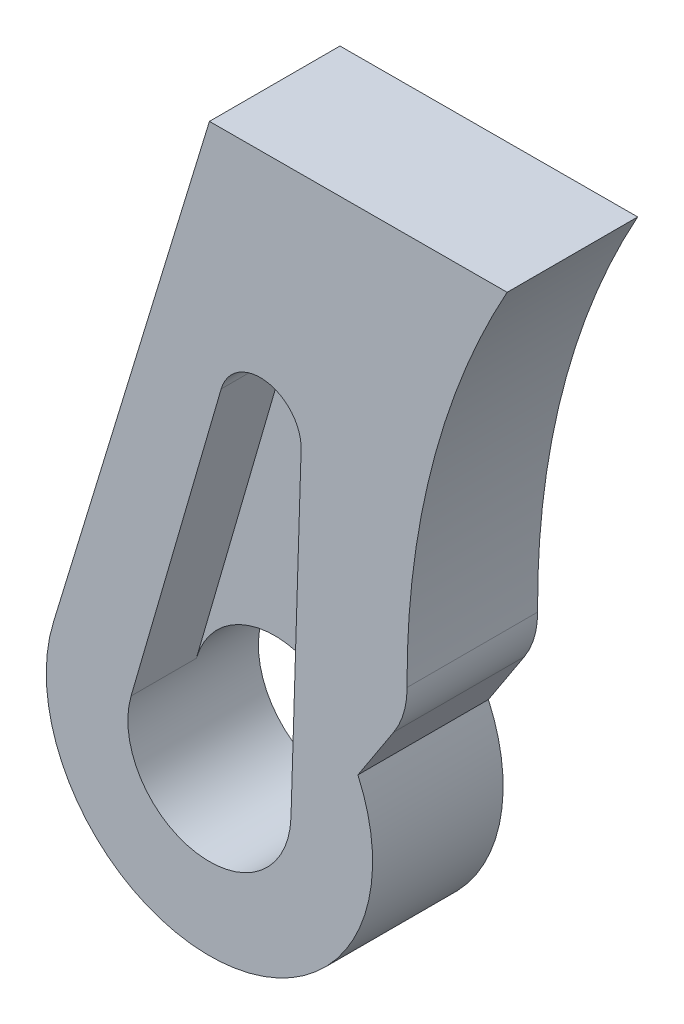
ISO-10303-21;
HEADER;
FILE_DESCRIPTION(('STEP AP214'),'2;1');
FILE_NAME('part.step','',(''),(''),'','','');
FILE_SCHEMA(('AUTOMOTIVE_DESIGN { 1 0 10303 214 1 1 1 1 }'));
ENDSEC;
DATA;
#1=APPLICATION_CONTEXT('core data for automotive mechanical design processes');
#2=APPLICATION_PROTOCOL_DEFINITION('international standard','automotive_design',2000,#1);
#3=PRODUCT_CONTEXT('',#1,'mechanical');
#4=PRODUCT('Part','Part','',(#3));
#5=PRODUCT_RELATED_PRODUCT_CATEGORY('part','',(#4));
#6=PRODUCT_DEFINITION_FORMATION('','',#4);
#7=PRODUCT_DEFINITION_CONTEXT('part definition',#1,'design');
#8=PRODUCT_DEFINITION('design','',#6,#7);
#9=PRODUCT_DEFINITION_SHAPE('','',#8);
#10=(LENGTH_UNIT() NAMED_UNIT(*) SI_UNIT(.MILLI.,.METRE.));
#11=(NAMED_UNIT(*) PLANE_ANGLE_UNIT() SI_UNIT($,.RADIAN.));
#12=(NAMED_UNIT(*) SI_UNIT($,.STERADIAN.) SOLID_ANGLE_UNIT());
#13=UNCERTAINTY_MEASURE_WITH_UNIT(LENGTH_MEASURE(1.E-05),#10,'distance_accuracy_value','');
#14=(GEOMETRIC_REPRESENTATION_CONTEXT(3) GLOBAL_UNCERTAINTY_ASSIGNED_CONTEXT((#13)) GLOBAL_UNIT_ASSIGNED_CONTEXT((#10,
#11,#12)) REPRESENTATION_CONTEXT('',''));
#15=CARTESIAN_POINT('',(0.,0.,0.));
#16=DIRECTION('',(0.,0.,1.));
#17=DIRECTION('',(1.,0.,0.));
#18=AXIS2_PLACEMENT_3D('',#15,#16,#17);
#19=CARTESIAN_POINT('',(0.,0.,8.));
#20=DIRECTION('',(0.,0.,-1.));
#21=DIRECTION('',(-1.,0.,0.));
#22=AXIS2_PLACEMENT_3D('',#19,#20,#21);
#23=CYLINDRICAL_SURFACE('',#22,5.);
#24=CARTESIAN_POINT('',(0.,0.,0.));
#25=DIRECTION('',(0.,0.,1.));
#26=DIRECTION('',(1.,0.,0.));
#27=AXIS2_PLACEMENT_3D('',#24,#25,#26);
#28=CIRCLE('',#27,5.);
#29=CARTESIAN_POINT('',(5.,0.,0.));
#30=VERTEX_POINT('',#29);
#31=EDGE_CURVE('E157',#30,#30,#28,.T.);
#32=ORIENTED_EDGE('',*,*,#31,.F.);
#33=EDGE_LOOP('',(#32));
#34=FACE_BOUND('',#33,.T.);
#35=CARTESIAN_POINT('',(0.,0.,8.));
#36=DIRECTION('',(0.,0.,1.));
#37=DIRECTION('',(1.,0.,0.));
#38=AXIS2_PLACEMENT_3D('',#35,#36,#37);
#39=CIRCLE('',#38,5.);
#40=CARTESIAN_POINT('',(-4.80254656117195,1.39123920580737,8.));
#41=VERTEX_POINT('',#40);
#42=CARTESIAN_POINT('',(4.99754882045745,-0.156543243688131,8.));
#43=VERTEX_POINT('',#42);
#44=EDGE_CURVE('E168',#41,#43,#39,.T.);
#45=ORIENTED_EDGE('',*,*,#44,.T.);
#46=DIRECTION('',(0.,0.,1.));
#47=VECTOR('',#46,1.);
#48=CARTESIAN_POINT('',(4.99754882045745,-0.156543243688131,4.));
#49=LINE('',#48,#47);
#50=CARTESIAN_POINT('',(4.99754882045745,-0.156543243688131,4.));
#51=VERTEX_POINT('',#50);
#52=EDGE_CURVE('E150',#51,#43,#49,.T.);
#53=ORIENTED_EDGE('',*,*,#52,.F.);
#54=CARTESIAN_POINT('',(0.,0.,4.));
#55=DIRECTION('',(0.,0.,1.));
#56=DIRECTION('',(1.,0.,0.));
#57=AXIS2_PLACEMENT_3D('',#54,#55,#56);
#58=CIRCLE('',#57,5.);
#59=CARTESIAN_POINT('',(-4.80254656117195,1.39123920580737,4.));
#60=VERTEX_POINT('',#59);
#61=EDGE_CURVE('E124',#51,#60,#58,.T.);
#62=ORIENTED_EDGE('',*,*,#61,.T.);
#63=DIRECTION('',(0.,0.,1.));
#64=VECTOR('',#63,1.);
#65=CARTESIAN_POINT('',(-4.80254656117195,1.39123920580737,4.));
#66=LINE('',#65,#64);
#67=EDGE_CURVE('E120',#60,#41,#66,.T.);
#68=ORIENTED_EDGE('',*,*,#67,.T.);
#69=EDGE_LOOP('',(#45,#53,#62,#68));
#70=FACE_BOUND('',#69,.T.);
#71=ADVANCED_FACE('F39',(#34,#70),#23,.F.);
#72=CARTESIAN_POINT('',(-9.56539161618039,2.91603896220644,8.));
#73=DIRECTION('',(0.956539161618038,-0.291603896220644,0.));
#74=DIRECTION('',(0.291603896220644,0.956539161618038,0.));
#75=AXIS2_PLACEMENT_3D('',#72,#73,#74);
#76=PLANE('',#75);
#77=DIRECTION('',(-0.291603896220644,-0.956539161618038,0.));
#78=VECTOR('',#77,1.);
#79=CARTESIAN_POINT('',(-9.56539161618039,2.91603896220644,0.));
#80=LINE('',#79,#78);
#81=CARTESIAN_POINT('',(0.,34.2930946040358,0.));
#82=VERTEX_POINT('',#81);
#83=CARTESIAN_POINT('',(-9.56539161618038,2.91603896220644,0.));
#84=VERTEX_POINT('',#83);
#85=EDGE_CURVE('E149',#82,#84,#80,.T.);
#86=ORIENTED_EDGE('',*,*,#85,.T.);
#87=DIRECTION('',(0.,0.,-1.));
#88=VECTOR('',#87,1.);
#89=CARTESIAN_POINT('',(-9.56539161618038,2.91603896220644,8.));
#90=LINE('',#89,#88);
#91=CARTESIAN_POINT('',(-9.56539161618038,2.91603896220644,8.));
#92=VERTEX_POINT('',#91);
#93=EDGE_CURVE('E192',#92,#84,#90,.T.);
#94=ORIENTED_EDGE('',*,*,#93,.F.);
#95=DIRECTION('',(-0.291603896220644,-0.956539161618038,0.));
#96=VECTOR('',#95,1.);
#97=CARTESIAN_POINT('',(-9.56539161618039,2.91603896220644,8.));
#98=LINE('',#97,#96);
#99=CARTESIAN_POINT('',(0.,34.2930946040358,8.));
#100=VERTEX_POINT('',#99);
#101=EDGE_CURVE('E153',#100,#92,#98,.T.);
#102=ORIENTED_EDGE('',*,*,#101,.F.);
#103=DIRECTION('',(0.,0.,-1.));
#104=VECTOR('',#103,1.);
#105=CARTESIAN_POINT('',(0.,34.2930946040358,8.));
#106=LINE('',#105,#104);
#107=EDGE_CURVE('E171',#100,#82,#106,.T.);
#108=ORIENTED_EDGE('',*,*,#107,.T.);
#109=EDGE_LOOP('',(#86,#94,#102,#108));
#110=FACE_BOUND('',#109,.T.);
#111=ADVANCED_FACE('F221',(#110),#76,.F.);
#112=CARTESIAN_POINT('',(0.,0.,8.));
#113=DIRECTION('',(0.,0.,-1.));
#114=DIRECTION('',(-1.,0.,0.));
#115=AXIS2_PLACEMENT_3D('',#112,#113,#114);
#116=CYLINDRICAL_SURFACE('',#115,10.);
#117=CARTESIAN_POINT('',(0.,0.,0.));
#118=DIRECTION('',(0.,0.,1.));
#119=DIRECTION('',(1.,0.,0.));
#120=AXIS2_PLACEMENT_3D('',#117,#118,#119);
#121=CIRCLE('',#120,10.);
#122=CARTESIAN_POINT('',(9.09715337627094,4.15232470413891,0.));
#123=VERTEX_POINT('',#122);
#124=EDGE_CURVE('E174',#84,#123,#121,.T.);
#125=ORIENTED_EDGE('',*,*,#124,.T.);
#126=DIRECTION('',(0.,0.,-1.));
#127=VECTOR('',#126,1.);
#128=CARTESIAN_POINT('',(9.09715337627094,4.15232470413891,8.));
#129=LINE('',#128,#127);
#130=CARTESIAN_POINT('',(9.09715337627094,4.15232470413891,8.));
#131=VERTEX_POINT('',#130);
#132=EDGE_CURVE('E189',#131,#123,#129,.T.);
#133=ORIENTED_EDGE('',*,*,#132,.F.);
#134=CARTESIAN_POINT('',(0.,0.,8.));
#135=DIRECTION('',(0.,0.,1.));
#136=DIRECTION('',(1.,0.,0.));
#137=AXIS2_PLACEMENT_3D('',#134,#135,#136);
#138=CIRCLE('',#137,10.);
#139=EDGE_CURVE('E156',#92,#131,#138,.T.);
#140=ORIENTED_EDGE('',*,*,#139,.F.);
#141=ORIENTED_EDGE('',*,*,#93,.T.);
#142=EDGE_LOOP('',(#125,#133,#140,#141));
#143=FACE_BOUND('',#142,.T.);
#144=ADVANCED_FACE('F227',(#143),#116,.T.);
#145=CARTESIAN_POINT('',(4.47876916712969,-2.92335031518233,8.));
#146=DIRECTION('',(0.837404025733565,-0.546584392098072,0.));
#147=DIRECTION('',(0.546584392098072,0.837404025733565,0.));
#148=AXIS2_PLACEMENT_3D('',#145,#146,#147);
#149=PLANE('',#148);
#150=DIRECTION('',(-0.546584392098072,-0.837404025733565,0.));
#151=VECTOR('',#150,1.);
#152=CARTESIAN_POINT('',(4.47876916712969,-2.92335031518233,0.));
#153=LINE('',#152,#151);
#154=CARTESIAN_POINT('',(11.2997418993409,7.52683836189885,0.));
#155=VERTEX_POINT('',#154);
#156=EDGE_CURVE('E177',#155,#123,#153,.T.);
#157=ORIENTED_EDGE('',*,*,#156,.F.);
#158=DIRECTION('',(0.,0.,-1.));
#159=VECTOR('',#158,1.);
#160=CARTESIAN_POINT('',(11.2997418993409,7.52683836189885,8.));
#161=LINE('',#160,#159);
#162=CARTESIAN_POINT('',(11.2997418993409,7.52683836189885,8.));
#163=VERTEX_POINT('',#162);
#164=EDGE_CURVE('E47',#155,#163,#161,.F.);
#165=ORIENTED_EDGE('',*,*,#164,.T.);
#166=DIRECTION('',(-0.546584392098072,-0.837404025733565,0.));
#167=VECTOR('',#166,1.);
#168=CARTESIAN_POINT('',(4.47876916712969,-2.92335031518233,8.));
#169=LINE('',#168,#167);
#170=EDGE_CURVE('E160',#163,#131,#169,.T.);
#171=ORIENTED_EDGE('',*,*,#170,.T.);
#172=ORIENTED_EDGE('',*,*,#132,.T.);
#173=EDGE_LOOP('',(#157,#165,#171,#172));
#174=FACE_BOUND('',#173,.T.);
#175=ADVANCED_FACE('F238',(#174),#149,.T.);
#176=CARTESIAN_POINT('',(60.710872791842,10.7049648955615,8.));
#177=DIRECTION('',(0.,0.,-1.));
#178=DIRECTION('',(-1.,0.,0.));
#179=AXIS2_PLACEMENT_3D('',#176,#177,#178);
#180=CYLINDRICAL_SURFACE('',#179,48.6);
#181=CARTESIAN_POINT('',(60.710872791842,10.7049648955615,8.));
#182=DIRECTION('',(0.,0.,1.));
#183=DIRECTION('',(1.,0.,0.));
#184=AXIS2_PLACEMENT_3D('',#181,#182,#183);
#185=CIRCLE('',#184,48.6);
#186=CARTESIAN_POINT('',(18.2476092566351,34.3445767777301,8.));
#187=VERTEX_POINT('',#186);
#188=CARTESIAN_POINT('',(12.1125492913045,10.3012905997374,8.));
#189=VERTEX_POINT('',#188);
#190=EDGE_CURVE('E162',#187,#189,#185,.T.);
#191=ORIENTED_EDGE('',*,*,#190,.T.);
#192=DIRECTION('',(0.,0.,-1.));
#193=VECTOR('',#192,1.);
#194=CARTESIAN_POINT('',(12.1125492913045,10.3012905997374,8.));
#195=LINE('',#194,#193);
#196=CARTESIAN_POINT('',(12.1125492913045,10.3012905997374,0.));
#197=VERTEX_POINT('',#196);
#198=EDGE_CURVE('E195',#189,#197,#195,.T.);
#199=ORIENTED_EDGE('',*,*,#198,.T.);
#200=CARTESIAN_POINT('',(60.710872791842,10.7049648955615,0.));
#201=DIRECTION('',(0.,0.,1.));
#202=DIRECTION('',(1.,0.,0.));
#203=AXIS2_PLACEMENT_3D('',#200,#201,#202);
#204=CIRCLE('',#203,48.6);
#205=CARTESIAN_POINT('',(18.2476092566351,34.3445767777301,0.));
#206=VERTEX_POINT('',#205);
#207=EDGE_CURVE('E179',#206,#197,#204,.T.);
#208=ORIENTED_EDGE('',*,*,#207,.F.);
#209=DIRECTION('',(0.,0.,-1.));
#210=VECTOR('',#209,1.);
#211=CARTESIAN_POINT('',(18.2476092566351,34.3445767777301,8.));
#212=LINE('',#211,#210);
#213=EDGE_CURVE('E187',#187,#206,#212,.T.);
#214=ORIENTED_EDGE('',*,*,#213,.F.);
#215=EDGE_LOOP('',(#191,#199,#208,#214));
#216=FACE_BOUND('',#215,.T.);
#217=ADVANCED_FACE('F201',(#216),#180,.F.);
#218=CARTESIAN_POINT('',(-0.0967507017122434,34.2928216402541,8.));
#219=DIRECTION('',(-0.0028212993865505,0.999996020126966,0.));
#220=DIRECTION('',(-0.999996020126966,-0.0028212993865505,0.));
#221=AXIS2_PLACEMENT_3D('',#218,#219,#220);
#222=PLANE('',#221);
#223=DIRECTION('',(0.999996020126966,0.0028212993865505,0.));
#224=VECTOR('',#223,1.);
#225=CARTESIAN_POINT('',(-0.0967507017122434,34.2928216402541,0.));
#226=LINE('',#225,#224);
#227=EDGE_CURVE('E181',#82,#206,#226,.T.);
#228=ORIENTED_EDGE('',*,*,#227,.F.);
#229=ORIENTED_EDGE('',*,*,#107,.F.);
#230=DIRECTION('',(0.999996020126966,0.0028212993865505,0.));
#231=VECTOR('',#230,1.);
#232=CARTESIAN_POINT('',(-0.0967507017122434,34.2928216402541,8.));
#233=LINE('',#232,#231);
#234=EDGE_CURVE('E165',#100,#187,#233,.T.);
#235=ORIENTED_EDGE('',*,*,#234,.T.);
#236=ORIENTED_EDGE('',*,*,#213,.T.);
#237=EDGE_LOOP('',(#228,#229,#235,#236));
#238=FACE_BOUND('',#237,.T.);
#239=ADVANCED_FACE('F210',(#238),#222,.T.);
#240=CARTESIAN_POINT('',(0.,0.,8.));
#241=DIRECTION('',(0.,0.,1.));
#242=DIRECTION('',(1.,0.,0.));
#243=AXIS2_PLACEMENT_3D('',#240,#241,#242);
#244=PLANE('',#243);
#245=DIRECTION('',(0.0313086487376258,0.999509764091489,0.));
#246=VECTOR('',#245,1.);
#247=CARTESIAN_POINT('',(4.99754882045745,-0.156543243688129,8.));
#248=LINE('',#247,#246);
#249=CARTESIAN_POINT('',(5.6188105587967,19.6768637720637,8.));
#250=VERTEX_POINT('',#249);
#251=EDGE_CURVE('E137',#43,#250,#248,.T.);
#252=ORIENTED_EDGE('',*,*,#251,.F.);
#253=ORIENTED_EDGE('',*,*,#44,.F.);
#254=DIRECTION('',(0.278247841161473,0.960509312234389,0.));
#255=VECTOR('',#254,1.);
#256=CARTESIAN_POINT('',(-4.80254656117195,1.39123920580737,8.));
#257=LINE('',#256,#255);
#258=CARTESIAN_POINT('',(0.718762867982005,20.4507549968115,8.));
#259=VERTEX_POINT('',#258);
#260=EDGE_CURVE('E140',#41,#259,#257,.T.);
#261=ORIENTED_EDGE('',*,*,#260,.T.);
#262=CARTESIAN_POINT('',(3.12003614856798,19.7551353939078,8.));
#263=DIRECTION('',(0.,0.,1.));
#264=DIRECTION('',(1.,0.,0.));
#265=AXIS2_PLACEMENT_3D('',#262,#263,#264);
#266=CIRCLE('',#265,2.49999999999998);
#267=EDGE_CURVE('E132',#250,#259,#266,.T.);
#268=ORIENTED_EDGE('',*,*,#267,.F.);
#269=EDGE_LOOP('',(#252,#253,#261,#268));
#270=FACE_BOUND('',#269,.T.);
#271=ORIENTED_EDGE('',*,*,#170,.F.);
#272=CARTESIAN_POINT('',(7.11272177067311,10.2597603223892,8.));
#273=DIRECTION('',(0.,0.,1.));
#274=DIRECTION('',(1.,0.,0.));
#275=AXIS2_PLACEMENT_3D('',#272,#273,#274);
#276=CIRCLE('',#275,5.);
#277=EDGE_CURVE('E11',#163,#189,#276,.T.);
#278=ORIENTED_EDGE('',*,*,#277,.T.);
#279=ORIENTED_EDGE('',*,*,#190,.F.);
#280=ORIENTED_EDGE('',*,*,#234,.F.);
#281=ORIENTED_EDGE('',*,*,#101,.T.);
#282=ORIENTED_EDGE('',*,*,#139,.T.);
#283=EDGE_LOOP('',(#271,#278,#279,#280,#281,#282));
#284=FACE_BOUND('',#283,.T.);
#285=ADVANCED_FACE('F214',(#270,#284),#244,.T.);
#286=CARTESIAN_POINT('',(0.,0.,0.));
#287=DIRECTION('',(0.,0.,1.));
#288=DIRECTION('',(1.,0.,0.));
#289=AXIS2_PLACEMENT_3D('',#286,#287,#288);
#290=PLANE('',#289);
#291=ORIENTED_EDGE('',*,*,#207,.T.);
#292=CARTESIAN_POINT('',(7.11272177067311,10.2597603223892,0.));
#293=DIRECTION('',(0.,0.,1.));
#294=DIRECTION('',(1.,0.,0.));
#295=AXIS2_PLACEMENT_3D('',#292,#293,#294);
#296=CIRCLE('',#295,5.);
#297=EDGE_CURVE('E61',#197,#155,#296,.F.);
#298=ORIENTED_EDGE('',*,*,#297,.T.);
#299=ORIENTED_EDGE('',*,*,#156,.T.);
#300=ORIENTED_EDGE('',*,*,#124,.F.);
#301=ORIENTED_EDGE('',*,*,#85,.F.);
#302=ORIENTED_EDGE('',*,*,#227,.T.);
#303=EDGE_LOOP('',(#291,#298,#299,#300,#301,#302));
#304=FACE_BOUND('',#303,.T.);
#305=ORIENTED_EDGE('',*,*,#31,.T.);
#306=EDGE_LOOP('',(#305));
#307=FACE_BOUND('',#306,.T.);
#308=ADVANCED_FACE('F205',(#304,#307),#290,.F.);
#309=CARTESIAN_POINT('',(3.12003614856798,19.7551353939078,4.));
#310=DIRECTION('',(0.,0.,1.));
#311=DIRECTION('',(1.,0.,0.));
#312=AXIS2_PLACEMENT_3D('',#309,#310,#311);
#313=CYLINDRICAL_SURFACE('',#312,2.49999999999998);
#314=ORIENTED_EDGE('',*,*,#267,.T.);
#315=DIRECTION('',(0.,0.,1.));
#316=VECTOR('',#315,1.);
#317=CARTESIAN_POINT('',(0.718762867982005,20.4507549968115,4.));
#318=LINE('',#317,#316);
#319=CARTESIAN_POINT('',(0.718762867982005,20.4507549968115,4.));
#320=VERTEX_POINT('',#319);
#321=EDGE_CURVE('E117',#320,#259,#318,.T.);
#322=ORIENTED_EDGE('',*,*,#321,.F.);
#323=CARTESIAN_POINT('',(3.12003614856798,19.7551353939078,4.));
#324=DIRECTION('',(0.,0.,1.));
#325=DIRECTION('',(1.,0.,0.));
#326=AXIS2_PLACEMENT_3D('',#323,#324,#325);
#327=CIRCLE('',#326,2.49999999999998);
#328=CARTESIAN_POINT('',(5.6188105587967,19.6768637720637,4.));
#329=VERTEX_POINT('',#328);
#330=EDGE_CURVE('E125',#329,#320,#327,.T.);
#331=ORIENTED_EDGE('',*,*,#330,.F.);
#332=DIRECTION('',(0.,0.,1.));
#333=VECTOR('',#332,1.);
#334=CARTESIAN_POINT('',(5.6188105587967,19.6768637720637,4.));
#335=LINE('',#334,#333);
#336=EDGE_CURVE('E147',#329,#250,#335,.T.);
#337=ORIENTED_EDGE('',*,*,#336,.T.);
#338=EDGE_LOOP('',(#314,#322,#331,#337));
#339=FACE_BOUND('',#338,.T.);
#340=ADVANCED_FACE('F129',(#339),#313,.F.);
#341=CARTESIAN_POINT('',(4.99754882045745,-0.156543243688129,4.));
#342=DIRECTION('',(0.999509764091489,-0.0313086487376258,0.));
#343=DIRECTION('',(0.0313086487376258,0.999509764091489,0.));
#344=AXIS2_PLACEMENT_3D('',#341,#342,#343);
#345=PLANE('',#344);
#346=ORIENTED_EDGE('',*,*,#251,.T.);
#347=ORIENTED_EDGE('',*,*,#336,.F.);
#348=DIRECTION('',(0.0313086487376258,0.999509764091489,0.));
#349=VECTOR('',#348,1.);
#350=CARTESIAN_POINT('',(4.99754882045745,-0.156543243688129,4.));
#351=LINE('',#350,#349);
#352=EDGE_CURVE('E133',#51,#329,#351,.T.);
#353=ORIENTED_EDGE('',*,*,#352,.F.);
#354=ORIENTED_EDGE('',*,*,#52,.T.);
#355=EDGE_LOOP('',(#346,#347,#353,#354));
#356=FACE_BOUND('',#355,.T.);
#357=ADVANCED_FACE('F279',(#356),#345,.F.);
#358=CARTESIAN_POINT('',(-4.80254656117195,1.39123920580737,4.));
#359=DIRECTION('',(0.960509312234389,-0.278247841161473,0.));
#360=DIRECTION('',(0.278247841161473,0.960509312234389,0.));
#361=AXIS2_PLACEMENT_3D('',#358,#359,#360);
#362=PLANE('',#361);
#363=ORIENTED_EDGE('',*,*,#260,.F.);
#364=ORIENTED_EDGE('',*,*,#67,.F.);
#365=DIRECTION('',(0.278247841161473,0.960509312234389,0.));
#366=VECTOR('',#365,1.);
#367=CARTESIAN_POINT('',(-4.80254656117195,1.39123920580737,4.));
#368=LINE('',#367,#366);
#369=EDGE_CURVE('E114',#60,#320,#368,.T.);
#370=ORIENTED_EDGE('',*,*,#369,.T.);
#371=ORIENTED_EDGE('',*,*,#321,.T.);
#372=EDGE_LOOP('',(#363,#364,#370,#371));
#373=FACE_BOUND('',#372,.T.);
#374=ADVANCED_FACE('F116',(#373),#362,.T.);
#375=CARTESIAN_POINT('',(3.12003614856798,19.7551353939078,4.));
#376=DIRECTION('',(0.,0.,1.));
#377=DIRECTION('',(1.,0.,0.));
#378=AXIS2_PLACEMENT_3D('',#375,#376,#377);
#379=PLANE('',#378);
#380=ORIENTED_EDGE('',*,*,#330,.T.);
#381=ORIENTED_EDGE('',*,*,#369,.F.);
#382=ORIENTED_EDGE('',*,*,#61,.F.);
#383=ORIENTED_EDGE('',*,*,#352,.T.);
#384=EDGE_LOOP('',(#380,#381,#382,#383));
#385=FACE_BOUND('',#384,.T.);
#386=ADVANCED_FACE('F135',(#385),#379,.T.);
#387=CARTESIAN_POINT('',(7.11272177067311,10.2597603223892,8.));
#388=DIRECTION('',(0.,0.,-1.));
#389=DIRECTION('',(-1.,0.,0.));
#390=AXIS2_PLACEMENT_3D('',#387,#388,#389);
#391=CYLINDRICAL_SURFACE('',#390,5.);
#392=ORIENTED_EDGE('',*,*,#277,.F.);
#393=ORIENTED_EDGE('',*,*,#164,.F.);
#394=ORIENTED_EDGE('',*,*,#297,.F.);
#395=ORIENTED_EDGE('',*,*,#198,.F.);
#396=EDGE_LOOP('',(#392,#393,#394,#395));
#397=FACE_BOUND('',#396,.T.);
#398=ADVANCED_FACE('F41',(#397),#391,.T.);
#399=CLOSED_SHELL('',(#71,#111,#144,#175,#217,#239,#285,#308,#340,#357,#374,#386,#398));
#400=MANIFOLD_SOLID_BREP('B2',#399);
#401=ADVANCED_BREP_SHAPE_REPRESENTATION('',(#18,#400),#14);
#402=SHAPE_DEFINITION_REPRESENTATION(#9,#401);
ENDSEC;
END-ISO-10303-21;
